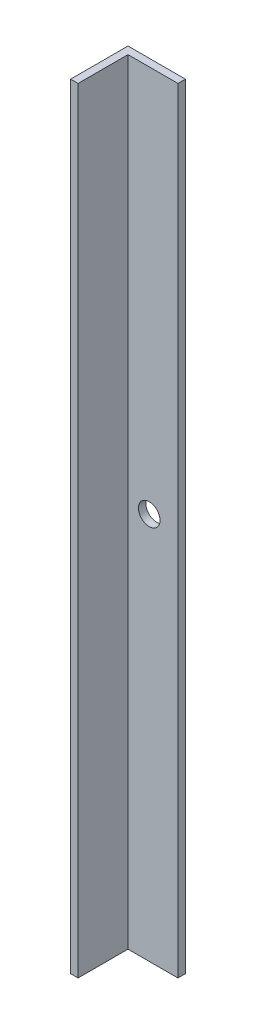
ISO-10303-21;
HEADER;
FILE_DESCRIPTION(('STEP AP214'),'2;1');
FILE_NAME('part.step','',(''),(''),'','','');
FILE_SCHEMA(('AUTOMOTIVE_DESIGN { 1 0 10303 214 1 1 1 1 }'));
ENDSEC;
DATA;
#1=APPLICATION_CONTEXT('core data for automotive mechanical design processes');
#2=APPLICATION_PROTOCOL_DEFINITION('international standard','automotive_design',2000,#1);
#3=PRODUCT_CONTEXT('',#1,'mechanical');
#4=PRODUCT('Part','Part','',(#3));
#5=PRODUCT_RELATED_PRODUCT_CATEGORY('part','',(#4));
#6=PRODUCT_DEFINITION_FORMATION('','',#4);
#7=PRODUCT_DEFINITION_CONTEXT('part definition',#1,'design');
#8=PRODUCT_DEFINITION('design','',#6,#7);
#9=PRODUCT_DEFINITION_SHAPE('','',#8);
#10=(LENGTH_UNIT() NAMED_UNIT(*) SI_UNIT(.MILLI.,.METRE.));
#11=(NAMED_UNIT(*) PLANE_ANGLE_UNIT() SI_UNIT($,.RADIAN.));
#12=(NAMED_UNIT(*) SI_UNIT($,.STERADIAN.) SOLID_ANGLE_UNIT());
#13=UNCERTAINTY_MEASURE_WITH_UNIT(LENGTH_MEASURE(1.E-05),#10,'distance_accuracy_value','');
#14=(GEOMETRIC_REPRESENTATION_CONTEXT(3) GLOBAL_UNCERTAINTY_ASSIGNED_CONTEXT((#13)) GLOBAL_UNIT_ASSIGNED_CONTEXT((#10,
#11,#12)) REPRESENTATION_CONTEXT('',''));
#15=CARTESIAN_POINT('',(0.,0.,0.));
#16=DIRECTION('',(0.,0.,1.));
#17=DIRECTION('',(1.,0.,0.));
#18=AXIS2_PLACEMENT_3D('',#15,#16,#17);
#19=CARTESIAN_POINT('',(0.,342.9,-25.4));
#20=DIRECTION('',(1.,0.,0.));
#21=DIRECTION('',(0.,0.,-1.));
#22=AXIS2_PLACEMENT_3D('',#19,#20,#21);
#23=PLANE('',#22);
#24=DIRECTION('',(0.,0.,1.));
#25=VECTOR('',#24,1.);
#26=CARTESIAN_POINT('',(0.,0.,-25.4));
#27=LINE('',#26,#25);
#28=CARTESIAN_POINT('',(0.,0.,-25.4));
#29=VERTEX_POINT('',#28);
#30=CARTESIAN_POINT('',(0.,0.,0.));
#31=VERTEX_POINT('',#30);
#32=EDGE_CURVE('E127',#29,#31,#27,.T.);
#33=ORIENTED_EDGE('',*,*,#32,.T.);
#34=DIRECTION('',(0.,-1.,0.));
#35=VECTOR('',#34,1.);
#36=CARTESIAN_POINT('',(0.,342.9,0.));
#37=LINE('',#36,#35);
#38=CARTESIAN_POINT('',(0.,342.9,0.));
#39=VERTEX_POINT('',#38);
#40=EDGE_CURVE('E11',#39,#31,#37,.T.);
#41=ORIENTED_EDGE('',*,*,#40,.F.);
#42=DIRECTION('',(0.,0.,1.));
#43=VECTOR('',#42,1.);
#44=CARTESIAN_POINT('',(0.,342.9,-25.4));
#45=LINE('',#44,#43);
#46=CARTESIAN_POINT('',(0.,342.9,-25.4));
#47=VERTEX_POINT('',#46);
#48=EDGE_CURVE('E138',#47,#39,#45,.T.);
#49=ORIENTED_EDGE('',*,*,#48,.F.);
#50=DIRECTION('',(0.,-1.,0.));
#51=VECTOR('',#50,1.);
#52=CARTESIAN_POINT('',(0.,342.9,-25.4));
#53=LINE('',#52,#51);
#54=EDGE_CURVE('E123',#47,#29,#53,.T.);
#55=ORIENTED_EDGE('',*,*,#54,.T.);
#56=EDGE_LOOP('',(#33,#41,#49,#55));
#57=FACE_BOUND('',#56,.T.);
#58=ADVANCED_FACE('F43',(#57),#23,.F.);
#59=CARTESIAN_POINT('',(0.,342.9,0.));
#60=DIRECTION('',(0.,0.,-1.));
#61=DIRECTION('',(-1.,0.,0.));
#62=AXIS2_PLACEMENT_3D('',#59,#60,#61);
#63=PLANE('',#62);
#64=DIRECTION('',(1.,0.,0.));
#65=VECTOR('',#64,1.);
#66=CARTESIAN_POINT('',(0.,0.,0.));
#67=LINE('',#66,#65);
#68=CARTESIAN_POINT('',(3.302,0.,0.));
#69=VERTEX_POINT('',#68);
#70=EDGE_CURVE('E130',#31,#69,#67,.T.);
#71=ORIENTED_EDGE('',*,*,#70,.T.);
#72=DIRECTION('',(0.,-1.,0.));
#73=VECTOR('',#72,1.);
#74=CARTESIAN_POINT('',(3.302,342.9,0.));
#75=LINE('',#74,#73);
#76=CARTESIAN_POINT('',(3.302,342.9,0.));
#77=VERTEX_POINT('',#76);
#78=EDGE_CURVE('E51',#77,#69,#75,.T.);
#79=ORIENTED_EDGE('',*,*,#78,.F.);
#80=DIRECTION('',(1.,0.,0.));
#81=VECTOR('',#80,1.);
#82=CARTESIAN_POINT('',(0.,342.9,0.));
#83=LINE('',#82,#81);
#84=EDGE_CURVE('E96',#39,#77,#83,.T.);
#85=ORIENTED_EDGE('',*,*,#84,.F.);
#86=ORIENTED_EDGE('',*,*,#40,.T.);
#87=EDGE_LOOP('',(#71,#79,#85,#86));
#88=FACE_BOUND('',#87,.T.);
#89=ADVANCED_FACE('F166',(#88),#63,.F.);
#90=CARTESIAN_POINT('',(3.302,342.9,0.));
#91=DIRECTION('',(-1.,0.,0.));
#92=DIRECTION('',(0.,0.,1.));
#93=AXIS2_PLACEMENT_3D('',#90,#91,#92);
#94=PLANE('',#93);
#95=DIRECTION('',(0.,0.,-1.));
#96=VECTOR('',#95,1.);
#97=CARTESIAN_POINT('',(3.302,0.,0.));
#98=LINE('',#97,#96);
#99=CARTESIAN_POINT('',(3.302,0.,-22.098));
#100=VERTEX_POINT('',#99);
#101=EDGE_CURVE('E133',#69,#100,#98,.T.);
#102=ORIENTED_EDGE('',*,*,#101,.T.);
#103=DIRECTION('',(0.,-1.,0.));
#104=VECTOR('',#103,1.);
#105=CARTESIAN_POINT('',(3.302,342.9,-22.098));
#106=LINE('',#105,#104);
#107=CARTESIAN_POINT('',(3.302,342.9,-22.098));
#108=VERTEX_POINT('',#107);
#109=EDGE_CURVE('E118',#108,#100,#106,.T.);
#110=ORIENTED_EDGE('',*,*,#109,.F.);
#111=DIRECTION('',(0.,0.,-1.));
#112=VECTOR('',#111,1.);
#113=CARTESIAN_POINT('',(3.302,342.9,0.));
#114=LINE('',#113,#112);
#115=EDGE_CURVE('E109',#77,#108,#114,.T.);
#116=ORIENTED_EDGE('',*,*,#115,.F.);
#117=ORIENTED_EDGE('',*,*,#78,.T.);
#118=EDGE_LOOP('',(#102,#110,#116,#117));
#119=FACE_BOUND('',#118,.T.);
#120=ADVANCED_FACE('F144',(#119),#94,.F.);
#121=CARTESIAN_POINT('',(3.302,342.9,-22.098));
#122=DIRECTION('',(0.,0.,-1.));
#123=DIRECTION('',(-1.,0.,0.));
#124=AXIS2_PLACEMENT_3D('',#121,#122,#123);
#125=PLANE('',#124);
#126=CARTESIAN_POINT('',(12.7,171.45,-22.098));
#127=DIRECTION('',(0.,0.,-1.));
#128=DIRECTION('',(-1.,0.,0.));
#129=AXIS2_PLACEMENT_3D('',#126,#127,#128);
#130=CIRCLE('',#129,4.7625);
#131=CARTESIAN_POINT('',(7.9375,171.45,-22.098));
#132=VERTEX_POINT('',#131);
#133=EDGE_CURVE('E131',#132,#132,#130,.F.);
#134=ORIENTED_EDGE('',*,*,#133,.F.);
#135=EDGE_LOOP('',(#134));
#136=FACE_BOUND('',#135,.T.);
#137=DIRECTION('',(1.,0.,0.));
#138=VECTOR('',#137,1.);
#139=CARTESIAN_POINT('',(3.302,0.,-22.098));
#140=LINE('',#139,#138);
#141=CARTESIAN_POINT('',(25.4,0.,-22.098));
#142=VERTEX_POINT('',#141);
#143=EDGE_CURVE('E117',#100,#142,#140,.T.);
#144=ORIENTED_EDGE('',*,*,#143,.T.);
#145=DIRECTION('',(0.,-1.,0.));
#146=VECTOR('',#145,1.);
#147=CARTESIAN_POINT('',(25.4,342.9,-22.098));
#148=LINE('',#147,#146);
#149=CARTESIAN_POINT('',(25.4,342.9,-22.098));
#150=VERTEX_POINT('',#149);
#151=EDGE_CURVE('E114',#150,#142,#148,.T.);
#152=ORIENTED_EDGE('',*,*,#151,.F.);
#153=DIRECTION('',(1.,0.,0.));
#154=VECTOR('',#153,1.);
#155=CARTESIAN_POINT('',(3.302,342.9,-22.098));
#156=LINE('',#155,#154);
#157=EDGE_CURVE('E103',#108,#150,#156,.T.);
#158=ORIENTED_EDGE('',*,*,#157,.F.);
#159=ORIENTED_EDGE('',*,*,#109,.T.);
#160=EDGE_LOOP('',(#144,#152,#158,#159));
#161=FACE_BOUND('',#160,.T.);
#162=ADVANCED_FACE('F115',(#136,#161),#125,.F.);
#163=CARTESIAN_POINT('',(25.4,342.9,-25.4));
#164=DIRECTION('',(-1.,0.,0.));
#165=DIRECTION('',(0.,0.,1.));
#166=AXIS2_PLACEMENT_3D('',#163,#164,#165);
#167=PLANE('',#166);
#168=DIRECTION('',(0.,0.,-1.));
#169=VECTOR('',#168,1.);
#170=CARTESIAN_POINT('',(25.4,0.,-25.4));
#171=LINE('',#170,#169);
#172=CARTESIAN_POINT('',(25.4,0.,-25.4));
#173=VERTEX_POINT('',#172);
#174=EDGE_CURVE('E82',#142,#173,#171,.T.);
#175=ORIENTED_EDGE('',*,*,#174,.T.);
#176=DIRECTION('',(0.,-1.,0.));
#177=VECTOR('',#176,1.);
#178=CARTESIAN_POINT('',(25.4,342.9,-25.4));
#179=LINE('',#178,#177);
#180=CARTESIAN_POINT('',(25.4,342.9,-25.4));
#181=VERTEX_POINT('',#180);
#182=EDGE_CURVE('E119',#181,#173,#179,.T.);
#183=ORIENTED_EDGE('',*,*,#182,.F.);
#184=DIRECTION('',(0.,0.,-1.));
#185=VECTOR('',#184,1.);
#186=CARTESIAN_POINT('',(25.4,342.9,-25.4));
#187=LINE('',#186,#185);
#188=EDGE_CURVE('E107',#150,#181,#187,.T.);
#189=ORIENTED_EDGE('',*,*,#188,.F.);
#190=ORIENTED_EDGE('',*,*,#151,.T.);
#191=EDGE_LOOP('',(#175,#183,#189,#190));
#192=FACE_BOUND('',#191,.T.);
#193=ADVANCED_FACE('F121',(#192),#167,.F.);
#194=CARTESIAN_POINT('',(0.,342.9,-25.4));
#195=DIRECTION('',(0.,0.,1.));
#196=DIRECTION('',(1.,0.,0.));
#197=AXIS2_PLACEMENT_3D('',#194,#195,#196);
#198=PLANE('',#197);
#199=CARTESIAN_POINT('',(12.7,171.45,-25.4));
#200=DIRECTION('',(0.,0.,-1.));
#201=DIRECTION('',(-1.,0.,0.));
#202=AXIS2_PLACEMENT_3D('',#199,#200,#201);
#203=CIRCLE('',#202,4.7625);
#204=CARTESIAN_POINT('',(7.9375,171.45,-25.4));
#205=VERTEX_POINT('',#204);
#206=EDGE_CURVE('E182',#205,#205,#203,.T.);
#207=ORIENTED_EDGE('',*,*,#206,.F.);
#208=EDGE_LOOP('',(#207));
#209=FACE_BOUND('',#208,.T.);
#210=DIRECTION('',(-1.,0.,0.));
#211=VECTOR('',#210,1.);
#212=CARTESIAN_POINT('',(0.,0.,-25.4));
#213=LINE('',#212,#211);
#214=EDGE_CURVE('E88',#173,#29,#213,.T.);
#215=ORIENTED_EDGE('',*,*,#214,.T.);
#216=ORIENTED_EDGE('',*,*,#54,.F.);
#217=DIRECTION('',(-1.,0.,0.));
#218=VECTOR('',#217,1.);
#219=CARTESIAN_POINT('',(0.,342.9,-25.4));
#220=LINE('',#219,#218);
#221=EDGE_CURVE('E59',#181,#47,#220,.T.);
#222=ORIENTED_EDGE('',*,*,#221,.F.);
#223=ORIENTED_EDGE('',*,*,#182,.T.);
#224=EDGE_LOOP('',(#215,#216,#222,#223));
#225=FACE_BOUND('',#224,.T.);
#226=ADVANCED_FACE('F151',(#209,#225),#198,.F.);
#227=CARTESIAN_POINT('',(0.,342.9,0.));
#228=DIRECTION('',(0.,1.,0.));
#229=DIRECTION('',(0.,0.,1.));
#230=AXIS2_PLACEMENT_3D('',#227,#228,#229);
#231=PLANE('',#230);
#232=ORIENTED_EDGE('',*,*,#48,.T.);
#233=ORIENTED_EDGE('',*,*,#84,.T.);
#234=ORIENTED_EDGE('',*,*,#115,.T.);
#235=ORIENTED_EDGE('',*,*,#157,.T.);
#236=ORIENTED_EDGE('',*,*,#188,.T.);
#237=ORIENTED_EDGE('',*,*,#221,.T.);
#238=EDGE_LOOP('',(#232,#233,#234,#235,#236,#237));
#239=FACE_BOUND('',#238,.T.);
#240=ADVANCED_FACE('F105',(#239),#231,.T.);
#241=CARTESIAN_POINT('',(0.,0.,0.));
#242=DIRECTION('',(0.,1.,0.));
#243=DIRECTION('',(0.,0.,1.));
#244=AXIS2_PLACEMENT_3D('',#241,#242,#243);
#245=PLANE('',#244);
#246=ORIENTED_EDGE('',*,*,#32,.F.);
#247=ORIENTED_EDGE('',*,*,#214,.F.);
#248=ORIENTED_EDGE('',*,*,#174,.F.);
#249=ORIENTED_EDGE('',*,*,#143,.F.);
#250=ORIENTED_EDGE('',*,*,#101,.F.);
#251=ORIENTED_EDGE('',*,*,#70,.F.);
#252=EDGE_LOOP('',(#246,#247,#248,#249,#250,#251));
#253=FACE_BOUND('',#252,.T.);
#254=ADVANCED_FACE('F147',(#253),#245,.F.);
#255=CARTESIAN_POINT('',(12.7,171.45,0.001000000000001));
#256=DIRECTION('',(0.,0.,-1.));
#257=DIRECTION('',(-1.,0.,0.));
#258=AXIS2_PLACEMENT_3D('',#255,#256,#257);
#259=CYLINDRICAL_SURFACE('',#258,4.7625);
#260=CARTESIAN_POINT('',(7.9375,171.45,-25.4));
#261=CARTESIAN_POINT('',(7.9375,171.45,-25.3656041666667));
#262=CARTESIAN_POINT('',(7.9375,171.45,-25.3312083333333));
#263=CARTESIAN_POINT('',(7.9375,171.45,-25.2624166666667));
#264=CARTESIAN_POINT('',(7.9375,171.45,-25.2280208333333));
#265=CARTESIAN_POINT('',(7.9375,171.45,-25.1592291666667));
#266=CARTESIAN_POINT('',(7.9375,171.45,-25.1248333333333));
#267=CARTESIAN_POINT('',(7.9375,171.45,-25.0560416666667));
#268=CARTESIAN_POINT('',(7.9375,171.45,-25.0216458333333));
#269=CARTESIAN_POINT('',(7.9375,171.45,-24.9528541666667));
#270=CARTESIAN_POINT('',(7.9375,171.45,-24.9184583333333));
#271=CARTESIAN_POINT('',(7.9375,171.45,-24.8496666666667));
#272=CARTESIAN_POINT('',(7.9375,171.45,-24.8152708333333));
#273=CARTESIAN_POINT('',(7.9375,171.45,-24.7464791666667));
#274=CARTESIAN_POINT('',(7.9375,171.45,-24.7120833333333));
#275=CARTESIAN_POINT('',(7.9375,171.45,-24.6432916666667));
#276=CARTESIAN_POINT('',(7.9375,171.45,-24.6088958333333));
#277=CARTESIAN_POINT('',(7.9375,171.45,-24.5401041666667));
#278=CARTESIAN_POINT('',(7.9375,171.45,-24.5057083333333));
#279=CARTESIAN_POINT('',(7.9375,171.45,-24.4369166666667));
#280=CARTESIAN_POINT('',(7.9375,171.45,-24.4025208333333));
#281=CARTESIAN_POINT('',(7.9375,171.45,-24.3337291666667));
#282=CARTESIAN_POINT('',(7.9375,171.45,-24.2993333333333));
#283=CARTESIAN_POINT('',(7.9375,171.45,-24.2305416666667));
#284=CARTESIAN_POINT('',(7.9375,171.45,-24.1961458333333));
#285=CARTESIAN_POINT('',(7.9375,171.45,-24.1273541666667));
#286=CARTESIAN_POINT('',(7.9375,171.45,-24.0929583333333));
#287=CARTESIAN_POINT('',(7.9375,171.45,-24.0241666666667));
#288=CARTESIAN_POINT('',(7.9375,171.45,-23.9897708333333));
#289=CARTESIAN_POINT('',(7.9375,171.45,-23.9209791666667));
#290=CARTESIAN_POINT('',(7.9375,171.45,-23.8865833333333));
#291=CARTESIAN_POINT('',(7.9375,171.45,-23.8177916666667));
#292=CARTESIAN_POINT('',(7.9375,171.45,-23.7833958333333));
#293=CARTESIAN_POINT('',(7.9375,171.45,-23.7146041666667));
#294=CARTESIAN_POINT('',(7.9375,171.45,-23.6802083333333));
#295=CARTESIAN_POINT('',(7.9375,171.45,-23.6114166666667));
#296=CARTESIAN_POINT('',(7.9375,171.45,-23.5770208333333));
#297=CARTESIAN_POINT('',(7.9375,171.45,-23.5082291666667));
#298=CARTESIAN_POINT('',(7.9375,171.45,-23.4738333333333));
#299=CARTESIAN_POINT('',(7.9375,171.45,-23.4050416666667));
#300=CARTESIAN_POINT('',(7.9375,171.45,-23.3706458333333));
#301=CARTESIAN_POINT('',(7.9375,171.45,-23.3018541666667));
#302=CARTESIAN_POINT('',(7.9375,171.45,-23.2674583333333));
#303=CARTESIAN_POINT('',(7.9375,171.45,-23.1986666666667));
#304=CARTESIAN_POINT('',(7.9375,171.45,-23.1642708333333));
#305=CARTESIAN_POINT('',(7.9375,171.45,-23.0954791666667));
#306=CARTESIAN_POINT('',(7.9375,171.45,-23.0610833333333));
#307=CARTESIAN_POINT('',(7.9375,171.45,-22.9922916666667));
#308=CARTESIAN_POINT('',(7.9375,171.45,-22.9578958333333));
#309=CARTESIAN_POINT('',(7.9375,171.45,-22.8891041666667));
#310=CARTESIAN_POINT('',(7.9375,171.45,-22.8547083333333));
#311=CARTESIAN_POINT('',(7.9375,171.45,-22.7859166666667));
#312=CARTESIAN_POINT('',(7.9375,171.45,-22.7515208333333));
#313=CARTESIAN_POINT('',(7.9375,171.45,-22.6827291666667));
#314=CARTESIAN_POINT('',(7.9375,171.45,-22.6483333333333));
#315=CARTESIAN_POINT('',(7.9375,171.45,-22.5795416666667));
#316=CARTESIAN_POINT('',(7.9375,171.45,-22.5451458333333));
#317=CARTESIAN_POINT('',(7.9375,171.45,-22.4763541666667));
#318=CARTESIAN_POINT('',(7.9375,171.45,-22.4419583333333));
#319=CARTESIAN_POINT('',(7.9375,171.45,-22.3731666666667));
#320=CARTESIAN_POINT('',(7.9375,171.45,-22.3387708333333));
#321=CARTESIAN_POINT('',(7.9375,171.45,-22.2699791666667));
#322=CARTESIAN_POINT('',(7.9375,171.45,-22.2355833333333));
#323=CARTESIAN_POINT('',(7.9375,171.45,-22.1667916666667));
#324=CARTESIAN_POINT('',(7.9375,171.45,-22.1323958333333));
#325=CARTESIAN_POINT('',(7.9375,171.45,-22.098));
#326=B_SPLINE_CURVE_WITH_KNOTS('',3,(#260,#261,#262,#263,#264,#265,#266,#267,#268,#269,#270,
#271,#272,#273,#274,#275,#276,#277,#278,#279,#280,#281,#282,#283,#284,#285,#286,#287,#288,#289,
#290,#291,#292,#293,#294,#295,#296,#297,#298,#299,#300,#301,#302,#303,#304,#305,#306,#307,#308,
#309,#310,#311,#312,#313,#314,#315,#316,#317,#318,#319,#320,#321,#322,#323,#324,#325),
.UNSPECIFIED.,.F.,.F.,(4,2,2,2,2,2,2,2,2,2,2,2,2,2,2,2,2,2,2,2,2,2,2,2,2,2,2,2,2,2,2,2,4),(0.,
0.103187500000001,0.206375000000002,0.309562499999999,0.41275,0.515937500000001,
0.619124999999998,0.722312499999999,0.8255,0.928687500000001,1.031875,1.1350625,1.23825,
1.3414375,1.444625,1.5478125,1.651,1.7541875,1.857375,1.9605625,2.06375,2.1669375,2.270125,
2.3733125,2.4765,2.5796875,2.682875,2.7860625,2.88925,2.9924375,3.095625,3.1988125,3.302),.UNSPECIFIED.);
#327=EDGE_CURVE('BSEAM189',#205,#132,#326,.T.);
#328=ORIENTED_EDGE('',*,*,#206,.T.);
#329=ORIENTED_EDGE('',*,*,#133,.T.);
#330=ORIENTED_EDGE('',*,*,#327,.T.);
#331=ORIENTED_EDGE('',*,*,#327,.F.);
#332=EDGE_LOOP('',(#328,#330,#329,#331));
#333=FACE_BOUND('',#332,.T.);
#334=ADVANCED_FACE('F189',(#333),#259,.F.);
#335=CLOSED_SHELL('',(#58,#89,#120,#162,#193,#226,#240,#254,#334));
#336=MANIFOLD_SOLID_BREP('B2',#335);
#337=ADVANCED_BREP_SHAPE_REPRESENTATION('',(#18,#336),#14);
#338=SHAPE_DEFINITION_REPRESENTATION(#9,#337);
ENDSEC;
END-ISO-10303-21;
